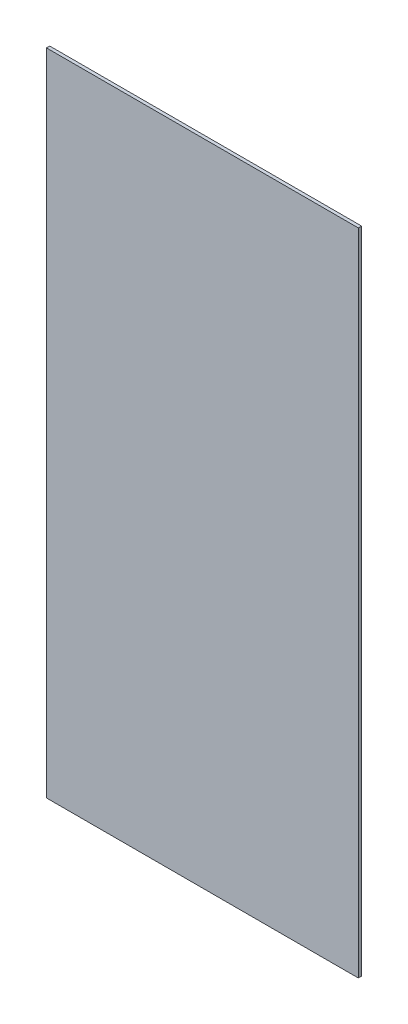
ISO-10303-21;
HEADER;
FILE_DESCRIPTION(('STEP AP214'),'2;1');
FILE_NAME('part.step','',(''),(''),'','','');
FILE_SCHEMA(('AUTOMOTIVE_DESIGN { 1 0 10303 214 1 1 1 1 }'));
ENDSEC;
DATA;
#1=APPLICATION_CONTEXT('core data for automotive mechanical design processes');
#2=APPLICATION_PROTOCOL_DEFINITION('international standard','automotive_design',2000,#1);
#3=PRODUCT_CONTEXT('',#1,'mechanical');
#4=PRODUCT('Part','Part','',(#3));
#5=PRODUCT_RELATED_PRODUCT_CATEGORY('part','',(#4));
#6=PRODUCT_DEFINITION_FORMATION('','',#4);
#7=PRODUCT_DEFINITION_CONTEXT('part definition',#1,'design');
#8=PRODUCT_DEFINITION('design','',#6,#7);
#9=PRODUCT_DEFINITION_SHAPE('','',#8);
#10=(LENGTH_UNIT() NAMED_UNIT(*) SI_UNIT(.MILLI.,.METRE.));
#11=(NAMED_UNIT(*) PLANE_ANGLE_UNIT() SI_UNIT($,.RADIAN.));
#12=(NAMED_UNIT(*) SI_UNIT($,.STERADIAN.) SOLID_ANGLE_UNIT());
#13=UNCERTAINTY_MEASURE_WITH_UNIT(LENGTH_MEASURE(1.E-05),#10,'distance_accuracy_value','');
#14=(GEOMETRIC_REPRESENTATION_CONTEXT(3) GLOBAL_UNCERTAINTY_ASSIGNED_CONTEXT((#13)) GLOBAL_UNIT_ASSIGNED_CONTEXT((#10,
#11,#12)) REPRESENTATION_CONTEXT('',''));
#15=CARTESIAN_POINT('',(0.,0.,0.));
#16=DIRECTION('',(0.,0.,1.));
#17=DIRECTION('',(1.,0.,0.));
#18=AXIS2_PLACEMENT_3D('',#15,#16,#17);
#19=CARTESIAN_POINT('',(0.,0.,-12.5));
#20=DIRECTION('',(1.,0.,0.));
#21=DIRECTION('',(0.,0.,-1.));
#22=AXIS2_PLACEMENT_3D('',#19,#20,#21);
#23=PLANE('',#22);
#24=DIRECTION('',(0.,1.,0.));
#25=VECTOR('',#24,1.);
#26=CARTESIAN_POINT('',(0.,0.,0.));
#27=LINE('',#26,#25);
#28=CARTESIAN_POINT('',(0.,0.,0.));
#29=VERTEX_POINT('',#28);
#30=CARTESIAN_POINT('',(0.,2500.,0.));
#31=VERTEX_POINT('',#30);
#32=EDGE_CURVE('E98',#29,#31,#27,.T.);
#33=ORIENTED_EDGE('',*,*,#32,.F.);
#34=DIRECTION('',(0.,0.,1.));
#35=VECTOR('',#34,1.);
#36=CARTESIAN_POINT('',(0.,0.,-12.5));
#37=LINE('',#36,#35);
#38=CARTESIAN_POINT('',(0.,0.,-12.5));
#39=VERTEX_POINT('',#38);
#40=EDGE_CURVE('E11',#39,#29,#37,.T.);
#41=ORIENTED_EDGE('',*,*,#40,.F.);
#42=DIRECTION('',(0.,1.,0.));
#43=VECTOR('',#42,1.);
#44=CARTESIAN_POINT('',(0.,0.,-12.5));
#45=LINE('',#44,#43);
#46=CARTESIAN_POINT('',(0.,2500.,-12.5));
#47=VERTEX_POINT('',#46);
#48=EDGE_CURVE('E92',#39,#47,#45,.T.);
#49=ORIENTED_EDGE('',*,*,#48,.T.);
#50=DIRECTION('',(0.,0.,1.));
#51=VECTOR('',#50,1.);
#52=CARTESIAN_POINT('',(0.,2500.,-12.5));
#53=LINE('',#52,#51);
#54=EDGE_CURVE('E37',#47,#31,#53,.T.);
#55=ORIENTED_EDGE('',*,*,#54,.T.);
#56=EDGE_LOOP('',(#33,#41,#49,#55));
#57=FACE_BOUND('',#56,.T.);
#58=ADVANCED_FACE('F34',(#57),#23,.T.);
#59=CARTESIAN_POINT('',(0.,0.,-12.5));
#60=DIRECTION('',(0.,-1.,0.));
#61=DIRECTION('',(1.,0.,0.));
#62=AXIS2_PLACEMENT_3D('',#59,#60,#61);
#63=PLANE('',#62);
#64=DIRECTION('',(1.,0.,0.));
#65=VECTOR('',#64,1.);
#66=CARTESIAN_POINT('',(0.,0.,0.));
#67=LINE('',#66,#65);
#68=CARTESIAN_POINT('',(-1200.,-1.46957615897682E-13,0.));
#69=VERTEX_POINT('',#68);
#70=EDGE_CURVE('E94',#69,#29,#67,.T.);
#71=ORIENTED_EDGE('',*,*,#70,.F.);
#72=DIRECTION('',(0.,0.,1.));
#73=VECTOR('',#72,1.);
#74=CARTESIAN_POINT('',(-1200.,-1.46957615897682E-13,-12.5));
#75=LINE('',#74,#73);
#76=CARTESIAN_POINT('',(-1200.,-1.46957615897682E-13,-12.5));
#77=VERTEX_POINT('',#76);
#78=EDGE_CURVE('E43',#77,#69,#75,.T.);
#79=ORIENTED_EDGE('',*,*,#78,.F.);
#80=DIRECTION('',(1.,0.,0.));
#81=VECTOR('',#80,1.);
#82=CARTESIAN_POINT('',(0.,0.,-12.5));
#83=LINE('',#82,#81);
#84=EDGE_CURVE('E89',#77,#39,#83,.T.);
#85=ORIENTED_EDGE('',*,*,#84,.T.);
#86=ORIENTED_EDGE('',*,*,#40,.T.);
#87=EDGE_LOOP('',(#71,#79,#85,#86));
#88=FACE_BOUND('',#87,.T.);
#89=ADVANCED_FACE('F108',(#88),#63,.T.);
#90=CARTESIAN_POINT('',(-1200.,-1.46957615897682E-13,-12.5));
#91=DIRECTION('',(-1.,0.,0.));
#92=DIRECTION('',(0.,0.,1.));
#93=AXIS2_PLACEMENT_3D('',#90,#91,#92);
#94=PLANE('',#93);
#95=DIRECTION('',(0.,-1.,0.));
#96=VECTOR('',#95,1.);
#97=CARTESIAN_POINT('',(-1200.,-1.46957615897682E-13,0.));
#98=LINE('',#97,#96);
#99=CARTESIAN_POINT('',(-1200.,2500.,0.));
#100=VERTEX_POINT('',#99);
#101=EDGE_CURVE('E84',#100,#69,#98,.T.);
#102=ORIENTED_EDGE('',*,*,#101,.F.);
#103=DIRECTION('',(0.,0.,1.));
#104=VECTOR('',#103,1.);
#105=CARTESIAN_POINT('',(-1200.,2500.,-12.5));
#106=LINE('',#105,#104);
#107=CARTESIAN_POINT('',(-1200.,2500.,-12.5));
#108=VERTEX_POINT('',#107);
#109=EDGE_CURVE('E79',#108,#100,#106,.T.);
#110=ORIENTED_EDGE('',*,*,#109,.F.);
#111=DIRECTION('',(0.,-1.,0.));
#112=VECTOR('',#111,1.);
#113=CARTESIAN_POINT('',(-1200.,-1.46957615897682E-13,-12.5));
#114=LINE('',#113,#112);
#115=EDGE_CURVE('E82',#108,#77,#114,.T.);
#116=ORIENTED_EDGE('',*,*,#115,.T.);
#117=ORIENTED_EDGE('',*,*,#78,.T.);
#118=EDGE_LOOP('',(#102,#110,#116,#117));
#119=FACE_BOUND('',#118,.T.);
#120=ADVANCED_FACE('F81',(#119),#94,.T.);
#121=CARTESIAN_POINT('',(0.,2500.,-12.5));
#122=DIRECTION('',(0.,1.,0.));
#123=DIRECTION('',(0.,0.,1.));
#124=AXIS2_PLACEMENT_3D('',#121,#122,#123);
#125=PLANE('',#124);
#126=DIRECTION('',(-1.,0.,0.));
#127=VECTOR('',#126,1.);
#128=CARTESIAN_POINT('',(0.,2500.,0.));
#129=LINE('',#128,#127);
#130=EDGE_CURVE('E101',#31,#100,#129,.T.);
#131=ORIENTED_EDGE('',*,*,#130,.F.);
#132=ORIENTED_EDGE('',*,*,#54,.F.);
#133=DIRECTION('',(-1.,0.,0.));
#134=VECTOR('',#133,1.);
#135=CARTESIAN_POINT('',(0.,2500.,-12.5));
#136=LINE('',#135,#134);
#137=EDGE_CURVE('E88',#47,#108,#136,.T.);
#138=ORIENTED_EDGE('',*,*,#137,.T.);
#139=ORIENTED_EDGE('',*,*,#109,.T.);
#140=EDGE_LOOP('',(#131,#132,#138,#139));
#141=FACE_BOUND('',#140,.T.);
#142=ADVANCED_FACE('F91',(#141),#125,.T.);
#143=CARTESIAN_POINT('',(0.,0.,-12.5));
#144=DIRECTION('',(0.,0.,1.));
#145=DIRECTION('',(1.,0.,0.));
#146=AXIS2_PLACEMENT_3D('',#143,#144,#145);
#147=PLANE('',#146);
#148=ORIENTED_EDGE('',*,*,#48,.F.);
#149=ORIENTED_EDGE('',*,*,#84,.F.);
#150=ORIENTED_EDGE('',*,*,#115,.F.);
#151=ORIENTED_EDGE('',*,*,#137,.F.);
#152=EDGE_LOOP('',(#148,#149,#150,#151));
#153=FACE_BOUND('',#152,.T.);
#154=ADVANCED_FACE('F87',(#153),#147,.F.);
#155=CARTESIAN_POINT('',(0.,0.,0.));
#156=DIRECTION('',(0.,0.,1.));
#157=DIRECTION('',(1.,0.,0.));
#158=AXIS2_PLACEMENT_3D('',#155,#156,#157);
#159=PLANE('',#158);
#160=ORIENTED_EDGE('',*,*,#32,.T.);
#161=ORIENTED_EDGE('',*,*,#130,.T.);
#162=ORIENTED_EDGE('',*,*,#101,.T.);
#163=ORIENTED_EDGE('',*,*,#70,.T.);
#164=EDGE_LOOP('',(#160,#161,#162,#163));
#165=FACE_BOUND('',#164,.T.);
#166=ADVANCED_FACE('F107',(#165),#159,.T.);
#167=CLOSED_SHELL('',(#58,#89,#120,#142,#154,#166));
#168=MANIFOLD_SOLID_BREP('B2',#167);
#169=ADVANCED_BREP_SHAPE_REPRESENTATION('',(#18,#168),#14);
#170=SHAPE_DEFINITION_REPRESENTATION(#9,#169);
ENDSEC;
END-ISO-10303-21;
